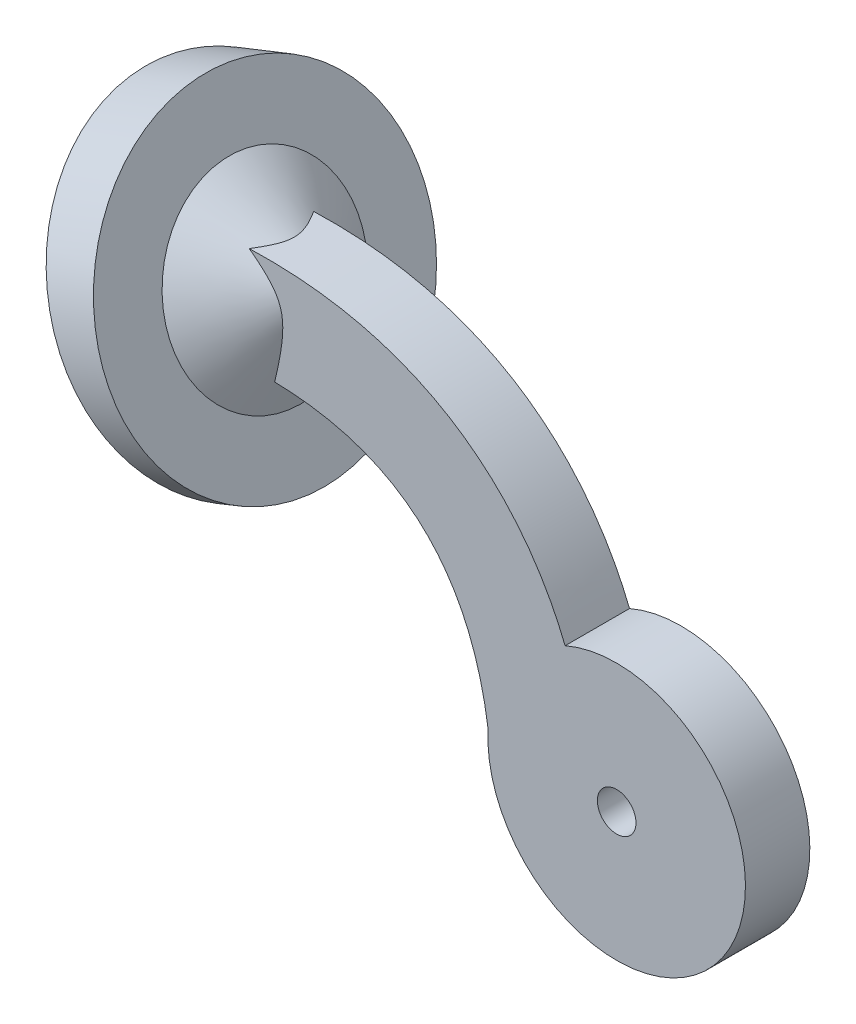
ISO-10303-21;
HEADER;
FILE_DESCRIPTION(('STEP AP214'),'2;1');
FILE_NAME('part.step','',(''),(''),'','','');
FILE_SCHEMA(('AUTOMOTIVE_DESIGN { 1 0 10303 214 1 1 1 1 }'));
ENDSEC;
DATA;
#1=APPLICATION_CONTEXT('core data for automotive mechanical design processes');
#2=APPLICATION_PROTOCOL_DEFINITION('international standard','automotive_design',2000,#1);
#3=PRODUCT_CONTEXT('',#1,'mechanical');
#4=PRODUCT('Part','Part','',(#3));
#5=PRODUCT_RELATED_PRODUCT_CATEGORY('part','',(#4));
#6=PRODUCT_DEFINITION_FORMATION('','',#4);
#7=PRODUCT_DEFINITION_CONTEXT('part definition',#1,'design');
#8=PRODUCT_DEFINITION('design','',#6,#7);
#9=PRODUCT_DEFINITION_SHAPE('','',#8);
#10=(LENGTH_UNIT() NAMED_UNIT(*) SI_UNIT(.MILLI.,.METRE.));
#11=(NAMED_UNIT(*) PLANE_ANGLE_UNIT() SI_UNIT($,.RADIAN.));
#12=(NAMED_UNIT(*) SI_UNIT($,.STERADIAN.) SOLID_ANGLE_UNIT());
#13=UNCERTAINTY_MEASURE_WITH_UNIT(LENGTH_MEASURE(1.E-05),#10,'distance_accuracy_value','');
#14=(GEOMETRIC_REPRESENTATION_CONTEXT(3) GLOBAL_UNCERTAINTY_ASSIGNED_CONTEXT((#13)) GLOBAL_UNIT_ASSIGNED_CONTEXT((#10,
#11,#12)) REPRESENTATION_CONTEXT('',''));
#15=CARTESIAN_POINT('',(0.,0.,0.));
#16=DIRECTION('',(0.,0.,1.));
#17=DIRECTION('',(1.,0.,0.));
#18=AXIS2_PLACEMENT_3D('',#15,#16,#17);
#19=CARTESIAN_POINT('',(-34.4570565539985,17.7708304764784,2.5));
#20=DIRECTION('',(0.92995625515955,0.367670183030424,0.));
#21=DIRECTION('',(-0.367670183030424,0.92995625515955,0.));
#22=AXIS2_PLACEMENT_3D('',#19,#20,#21);
#23=CYLINDRICAL_SURFACE('',#22,12.5);
#24=CARTESIAN_POINT('',(-32.8407138616819,18.409872377887,2.5));
#25=DIRECTION('',(0.870458463077709,0.492241875561591,0.));
#26=DIRECTION('',(0.492241875561591,-0.870458463077709,0.));
#27=AXIS2_PLACEMENT_3D('',#24,#25,#26);
#28=ELLIPSE('',#27,12.620259040557,12.5);
#29=CARTESIAN_POINT('',(-26.628493881485,7.42446108980115,2.5));
#30=VERTEX_POINT('',#29);
#31=EDGE_CURVE('E95',#30,#30,#28,.T.);
#32=ORIENTED_EDGE('',*,*,#31,.T.);
#33=EDGE_LOOP('',(#32));
#34=FACE_BOUND('',#33,.T.);
#35=CARTESIAN_POINT('',(-29.8072752782007,19.6091813916305,2.5));
#36=DIRECTION('',(-0.92995625515955,-0.367670183030424,0.));
#37=DIRECTION('',(0.367670183030424,-0.92995625515955,0.));
#38=AXIS2_PLACEMENT_3D('',#35,#36,#37);
#39=CIRCLE('',#38,12.5);
#40=CARTESIAN_POINT('',(-25.2113979903204,7.98472820213617,2.5));
#41=VERTEX_POINT('',#40);
#42=EDGE_CURVE('E138',#41,#41,#39,.T.);
#43=ORIENTED_EDGE('',*,*,#42,.T.);
#44=EDGE_LOOP('',(#43));
#45=FACE_BOUND('',#44,.T.);
#46=ADVANCED_FACE('F36',(#34,#45),#23,.T.);
#47=CARTESIAN_POINT('',(-29.8072752782007,19.6091813916305,2.5));
#48=DIRECTION('',(-0.92995625515955,-0.367670183030424,0.));
#49=DIRECTION('',(0.367670183030424,-0.92995625515955,0.));
#50=AXIS2_PLACEMENT_3D('',#47,#48,#49);
#51=PLANE('',#50);
#52=CARTESIAN_POINT('',(-29.8072752782007,19.6091813916306,2.5));
#53=DIRECTION('',(-0.92995625515955,-0.367670183030424,0.));
#54=DIRECTION('',(0.367670183030424,-0.92995625515955,0.));
#55=AXIS2_PLACEMENT_3D('',#52,#53,#54);
#56=CIRCLE('',#55,7.50000000000001);
#57=CARTESIAN_POINT('',(-27.0497489054726,12.6345094779339,2.5));
#58=VERTEX_POINT('',#57);
#59=EDGE_CURVE('E11',#58,#58,#56,.F.);
#60=ORIENTED_EDGE('',*,*,#59,.F.);
#61=EDGE_LOOP('',(#60));
#62=FACE_BOUND('',#61,.T.);
#63=ORIENTED_EDGE('',*,*,#42,.F.);
#64=EDGE_LOOP('',(#63));
#65=FACE_BOUND('',#64,.T.);
#66=ADVANCED_FACE('F182',(#62,#65),#51,.F.);
#67=CARTESIAN_POINT('',(-29.8072752782007,19.6091813916306,2.5));
#68=DIRECTION('',(-0.92995625515955,-0.367670183030424,0.));
#69=DIRECTION('',(-0.367670183030424,0.92995625515955,0.));
#70=AXIS2_PLACEMENT_3D('',#67,#68,#69);
#71=CONICAL_SURFACE('',#70,7.5,0.907571211037052);
#72=ORIENTED_EDGE('',*,*,#59,.T.);
#73=EDGE_LOOP('',(#72));
#74=FACE_BOUND('',#73,.T.);
#75=CARTESIAN_POINT('',(-31.1205374343894,23.6069702838381,-3.32523190287827));
#76=CARTESIAN_POINT('',(-31.0051639936193,23.6069702838381,-3.18649705970843));
#77=CARTESIAN_POINT('',(-30.8900523835198,23.6069702838381,-3.04754312371583));
#78=CARTESIAN_POINT('',(-30.6605097439369,23.6069702838381,-2.76906339166854));
#79=CARTESIAN_POINT('',(-30.5460787470098,23.6069702838381,-2.62953756878902));
#80=CARTESIAN_POINT('',(-30.3178228603325,23.6069702838381,-2.34949616964888));
#81=CARTESIAN_POINT('',(-30.2039997763352,23.6069702838381,-2.20897911982826));
#82=CARTESIAN_POINT('',(-29.9774469717052,23.6069702838381,-1.92707123248217));
#83=CARTESIAN_POINT('',(-29.8647172230717,23.6069702838381,-1.78568041748689));
#84=CARTESIAN_POINT('',(-29.6354836421515,23.6069702838381,-1.49519554390859));
#85=CARTESIAN_POINT('',(-29.5190471355668,23.6069702838381,-1.34604825346297));
#86=CARTESIAN_POINT('',(-29.288280191936,23.6069702838381,-1.04613432369152));
#87=CARTESIAN_POINT('',(-29.173949697126,23.6069702838381,-0.895367728960329));
#88=CARTESIAN_POINT('',(-28.9483389987224,23.6069702838381,-0.591778833231446));
#89=CARTESIAN_POINT('',(-28.8370560641258,23.6069702838381,-0.438958568773274));
#90=CARTESIAN_POINT('',(-28.618765934393,23.6069702838381,-0.130306331065555));
#91=CARTESIAN_POINT('',(-28.5117579599499,23.6069702838381,0.0255250855081514));
#92=CARTESIAN_POINT('',(-28.3336454107236,23.6069702838381,0.296777324323483));
#93=CARTESIAN_POINT('',(-28.2609526771352,23.6069702838381,0.41114942549434));
#94=CARTESIAN_POINT('',(-28.1202446670072,23.6069702838381,0.642839890528727));
#95=CARTESIAN_POINT('',(-28.0522317499643,23.6069702838381,0.760159700477639));
#96=CARTESIAN_POINT('',(-27.9233519520669,23.6069702838381,0.997842444176017));
#97=CARTESIAN_POINT('',(-27.8624457434877,23.6069702838381,1.11818366420332));
#98=CARTESIAN_POINT('',(-27.7504745698976,23.6069702838381,1.36327759556224));
#99=CARTESIAN_POINT('',(-27.6993995695899,23.6069702838381,1.48802565292288));
#100=CARTESIAN_POINT('',(-27.6061381373363,23.6069702838381,1.75843201354046));
#101=CARTESIAN_POINT('',(-27.5658115214314,23.6069702838381,1.90477777717941));
#102=CARTESIAN_POINT('',(-27.5245946546406,23.6069702838381,2.12740718603607));
#103=CARTESIAN_POINT('',(-27.5140705985687,23.6069702838381,2.20192663135317));
#104=CARTESIAN_POINT('',(-27.4999938967879,23.6069702838381,2.35163564738552));
#105=CARTESIAN_POINT('',(-27.4964405825722,23.6069702838381,2.42682515314595));
#106=CARTESIAN_POINT('',(-27.4965678246843,23.6069702838381,2.57749245069094));
#107=CARTESIAN_POINT('',(-27.5002769309905,23.6069702838381,2.65297021138838));
#108=CARTESIAN_POINT('',(-27.5147173319459,23.6069702838381,2.80324546374975));
#109=CARTESIAN_POINT('',(-27.5254493979574,23.6069702838381,2.87804287977336));
#110=CARTESIAN_POINT('',(-27.5533294339199,23.6069702838381,3.0268979485597));
#111=CARTESIAN_POINT('',(-27.5705173297153,23.6069702838381,3.10094799041398));
#112=CARTESIAN_POINT('',(-27.610372086373,23.6069702838381,3.24753734435399));
#113=CARTESIAN_POINT('',(-27.6330391932752,23.6069702838381,3.3200765884396));
#114=CARTESIAN_POINT('',(-27.6888500574699,23.6069702838381,3.48068765369976));
#115=CARTESIAN_POINT('',(-27.7232031029773,23.6069702838381,3.56833571883545));
#116=CARTESIAN_POINT('',(-27.7972756176536,23.6069702838381,3.74135509108605));
#117=CARTESIAN_POINT('',(-27.8369981634198,23.6069702838381,3.826725059077));
#118=CARTESIAN_POINT('',(-27.9206195615101,23.6069702838381,3.99557779536554));
#119=CARTESIAN_POINT('',(-27.9645261889795,23.6069702838381,4.07905667882809));
#120=CARTESIAN_POINT('',(-28.055506644688,23.6069702838381,4.24427365369316));
#121=CARTESIAN_POINT('',(-28.1025809523164,23.6069702838381,4.32601147913265));
#122=CARTESIAN_POINT('',(-28.1998555449538,23.6069702838381,4.48914055628722));
#123=CARTESIAN_POINT('',(-28.2500901621558,23.6069702838381,4.57051123214097));
#124=CARTESIAN_POINT('',(-28.3525402222912,23.6069702838381,4.7319946413547));
#125=CARTESIAN_POINT('',(-28.4047557336011,23.6069702838381,4.81210733115624));
#126=CARTESIAN_POINT('',(-28.5106889616268,23.6069702838381,4.97117695478836));
#127=CARTESIAN_POINT('',(-28.5644045943217,23.6069702838381,5.05013528045633));
#128=CARTESIAN_POINT('',(-28.6731020634842,23.6069702838381,5.2071689418581));
#129=CARTESIAN_POINT('',(-28.7280838533824,23.6069702838381,5.28524430991017));
#130=CARTESIAN_POINT('',(-28.9300254318794,23.6069702838381,5.56804773187805));
#131=CARTESIAN_POINT('',(-29.0800246440807,23.6069702838381,5.77060385207274));
#132=CARTESIAN_POINT('',(-29.3843688496473,23.6069702838381,6.17243284649893));
#133=CARTESIAN_POINT('',(-29.5387144522953,23.6069702838381,6.37170525414627));
#134=CARTESIAN_POINT('',(-29.8503406587801,23.6069702838381,6.7680563102495));
#135=CARTESIAN_POINT('',(-30.0076223202869,23.6069702838381,6.96513412566687));
#136=CARTESIAN_POINT('',(-30.3241779929453,23.6069702838381,7.35768399407499));
#137=CARTESIAN_POINT('',(-30.4834520398182,23.6069702838381,7.55315601817129));
#138=CARTESIAN_POINT('',(-30.8037188119825,23.6069702838381,7.94326721630479));
#139=CARTESIAN_POINT('',(-30.9647140878283,23.6069702838381,8.13790429390539));
#140=CARTESIAN_POINT('',(-31.2877794307574,23.6069702838381,8.52628787659347));
#141=CARTESIAN_POINT('',(-31.4498495126371,23.6069702838381,8.7200343693582));
#142=CARTESIAN_POINT('',(-31.9371951925877,23.6069702838381,9.30016444051819));
#143=CARTESIAN_POINT('',(-32.2636818557847,23.6069702838381,9.68553018434634));
#144=CARTESIAN_POINT('',(-32.878818339227,23.6069702838381,10.4078054432851));
#145=CARTESIAN_POINT('',(-33.1672412490756,23.6069702838381,10.7449087234719));
#146=CARTESIAN_POINT('',(-33.7451879924232,23.6069702838381,11.4182114746225));
#147=CARTESIAN_POINT('',(-34.0347119022587,23.6069702838381,11.7544108800532));
#148=CARTESIAN_POINT('',(-34.6137270727659,23.6069702838381,12.4252040200239));
#149=CARTESIAN_POINT('',(-34.9032161760065,23.6069702838381,12.7597996182542));
#150=CARTESIAN_POINT('',(-35.4827611025959,23.6069702838381,13.4284550628686));
#151=CARTESIAN_POINT('',(-35.7728168810431,23.6069702838381,13.7625149481631));
#152=CARTESIAN_POINT('',(-36.0630759827099,23.6069702838381,14.0963975880467));
#153=B_SPLINE_CURVE_WITH_KNOTS('',3,(#75,#76,#77,#78,#79,#80,#81,#82,#83,#84,#85,#86,#87,#88,
#89,#90,#91,#92,#93,#94,#95,#96,#97,#98,#99,#100,#101,#102,#103,#104,#105,#106,#107,#108,#109,
#110,#111,#112,#113,#114,#115,#116,#117,#118,#119,#120,#121,#122,#123,#124,#125,#126,#127,#128,
#129,#130,#131,#132,#133,#134,#135,#136,#137,#138,#139,#140,#141,#142,#143,#144,#145,#146,#147,
#148,#149,#150,#151,#152),.UNSPECIFIED.,.F.,.F.,(4,2,2,2,2,2,2,2,2,2,2,2,2,2,2,2,2,2,2,2,2,2,2,
2,2,2,2,2,2,2,2,2,2,2,2,2,2,2,4),(0.,0.541319518792293,1.0826647260282,1.6251608109496,
2.16764296539269,2.73527523040452,3.30289190305323,3.86998206893478,4.43696838053689,
4.84344375573494,5.25012259068257,5.65443189512884,6.05832628270889,6.51178303195432,
6.73727656901034,6.96274847976637,7.18910854394296,7.41549347441308,7.64330216473084,
7.87112108652492,8.15329966433827,8.43564061463926,8.71851685976914,9.00143601142438,
9.28828405625616,9.57514201155001,9.86161954295513,10.1480865544653,10.9041177215771,
11.6602554029577,12.4166709387781,13.1731000557892,13.9308729582787,14.6886563144553,
16.2038667398147,17.5348182505341,18.8658637878779,20.1932000505747,21.5204350907405),.UNSPECIFIED.);
#154=CARTESIAN_POINT('',(-28.5305711808186,23.6069702838381,0.));
#155=VERTEX_POINT('',#154);
#156=CARTESIAN_POINT('',(-28.4926601522574,23.6069702838381,0.0561379007340008));
#157=VERTEX_POINT('',#156);
#158=EDGE_CURVE('E97',#155,#157,#153,.T.);
#159=ORIENTED_EDGE('',*,*,#158,.F.);
#160=CARTESIAN_POINT('',(-29.2800834948723,5.57941477040267,0.));
#161=CARTESIAN_POINT('',(-29.1869362196633,5.9055074622979,0.));
#162=CARTESIAN_POINT('',(-29.093949304872,6.23164602567897,0.));
#163=CARTESIAN_POINT('',(-28.9083743878704,6.88403727023297,0.));
#164=CARTESIAN_POINT('',(-28.8157863864106,7.21028995161933,0.));
#165=CARTESIAN_POINT('',(-28.5387180643976,8.18932333472033,0.));
#166=CARTESIAN_POINT('',(-28.3549541386555,8.8423069961599,0.));
#167=CARTESIAN_POINT('',(-27.992544960449,10.1411668147796,0.));
#168=CARTESIAN_POINT('',(-27.8138646601903,10.7870331509975,0.));
#169=CARTESIAN_POINT('',(-27.5494038589756,11.7567797927855,0.));
#170=CARTESIAN_POINT('',(-27.4618465611984,12.0801750977669,0.));
#171=CARTESIAN_POINT('',(-27.2883279661573,12.7273931241951,0.));
#172=CARTESIAN_POINT('',(-27.2023666617791,13.0512158437297,0.));
#173=CARTESIAN_POINT('',(-27.0468647267721,13.6450623314767,0.));
#174=CARTESIAN_POINT('',(-26.9769885702604,13.9149981039332,0.));
#175=CARTESIAN_POINT('',(-26.8392486777998,14.4554193288412,0.));
#176=CARTESIAN_POINT('',(-26.7713851863357,14.725904843842,0.));
#177=CARTESIAN_POINT('',(-26.6379738010209,15.2694390038592,0.));
#178=CARTESIAN_POINT('',(-26.5724452449148,15.5424924098266,0.));
#179=CARTESIAN_POINT('',(-26.4454087640843,16.0894363077118,0.));
#180=CARTESIAN_POINT('',(-26.3838993309241,16.3633264447217,0.));
#181=CARTESIAN_POINT('',(-26.2959151033157,16.7761376086191,0.));
#182=CARTESIAN_POINT('',(-26.2672032185622,16.9145809911834,0.));
#183=CARTESIAN_POINT('',(-26.2116938137583,17.1918497096161,0.));
#184=CARTESIAN_POINT('',(-26.184896246354,17.330675035948,0.));
#185=CARTESIAN_POINT('',(-26.1336741213904,17.609004929105,0.));
#186=CARTESIAN_POINT('',(-26.1092535861228,17.7485102417407,0.));
#187=CARTESIAN_POINT('',(-26.0635295413135,18.028029379687,0.));
#188=CARTESIAN_POINT('',(-26.0422258671515,18.1680431777409,0.));
#189=CARTESIAN_POINT('',(-26.0038264738955,18.447623886291,0.));
#190=CARTESIAN_POINT('',(-25.986701403564,18.5871866921213,0.));
#191=CARTESIAN_POINT('',(-25.9577531610034,18.8669222988036,0.));
#192=CARTESIAN_POINT('',(-25.9459315237782,19.0070952644199,0.));
#193=CARTESIAN_POINT('',(-25.9294174185569,19.2874885539533,0.));
#194=CARTESIAN_POINT('',(-25.9247046944716,19.427707600269,0.));
#195=CARTESIAN_POINT('',(-25.9247538157918,19.708108750193,0.));
#196=CARTESIAN_POINT('',(-25.9295079033451,19.8482907899767,0.));
#197=CARTESIAN_POINT('',(-25.9483056098937,20.0875470174699,0.));
#198=CARTESIAN_POINT('',(-25.9592862156762,20.1868550313554,0.));
#199=CARTESIAN_POINT('',(-25.9886977407466,20.3843951689487,0.));
#200=CARTESIAN_POINT('',(-26.0071287013221,20.4826272866911,0.));
#201=CARTESIAN_POINT('',(-26.0522113882823,20.6765028103061,0.));
#202=CARTESIAN_POINT('',(-26.0788059141249,20.7721593430004,0.));
#203=CARTESIAN_POINT('',(-26.140691971557,20.960623711088,0.));
#204=CARTESIAN_POINT('',(-26.1759829825355,21.0534317166331,0.));
#205=CARTESIAN_POINT('',(-26.2550667289289,21.2354260658087,0.));
#206=CARTESIAN_POINT('',(-26.2988657370792,21.3246096782387,0.));
#207=CARTESIAN_POINT('',(-26.3941207239742,21.4987939478743,0.));
#208=CARTESIAN_POINT('',(-26.4455789329476,21.583793377092,0.));
#209=CARTESIAN_POINT('',(-26.5553838184296,21.7501435531691,0.));
#210=CARTESIAN_POINT('',(-26.6137809021972,21.8314608258191,0.));
#211=CARTESIAN_POINT('',(-26.7053317594127,21.9503362675322,0.));
#212=CARTESIAN_POINT('',(-26.7365067063622,21.9894432986491,0.));
#213=CARTESIAN_POINT('',(-26.8000386655689,22.0666893680294,0.));
#214=CARTESIAN_POINT('',(-26.8323957379019,22.1048283569292,0.));
#215=CARTESIAN_POINT('',(-26.9321197765667,22.219123155537,0.));
#216=CARTESIAN_POINT('',(-27.0011244469455,22.2938531060443,0.));
#217=CARTESIAN_POINT('',(-27.142491234539,22.4400817253065,0.));
#218=CARTESIAN_POINT('',(-27.2148544290605,22.5115793425111,0.));
#219=CARTESIAN_POINT('',(-27.3622579663912,22.6519111308992,0.));
#220=CARTESIAN_POINT('',(-27.4373011210452,22.7207423366559,0.));
#221=CARTESIAN_POINT('',(-27.5894339617086,22.8561110072996,0.));
#222=CARTESIAN_POINT('',(-27.6665238841224,22.9226482051677,0.));
#223=CARTESIAN_POINT('',(-27.9008554754016,23.1199631043415,0.));
#224=CARTESIAN_POINT('',(-28.0605244376195,23.2478544738959,0.));
#225=CARTESIAN_POINT('',(-28.3838723133582,23.4981885533761,0.));
#226=CARTESIAN_POINT('',(-28.5475487921838,23.6206344501999,0.));
#227=CARTESIAN_POINT('',(-28.8804900124381,23.863723651399,0.));
#228=CARTESIAN_POINT('',(-29.0498024488718,23.9843014070908,0.));
#229=CARTESIAN_POINT('',(-29.3904679465552,24.2225733494064,0.));
#230=CARTESIAN_POINT('',(-29.561821270884,24.3402671581657,0.));
#231=CARTESIAN_POINT('',(-29.9054998223318,24.5731529790978,0.));
#232=CARTESIAN_POINT('',(-30.0778208530663,24.6883511978872,0.));
#233=CARTESIAN_POINT('',(-30.4235457183062,24.9170888883564,0.));
#234=CARTESIAN_POINT('',(-30.5969494982178,25.0306284427198,0.));
#235=CARTESIAN_POINT('',(-31.1245033547959,25.3733024444297,0.));
#236=CARTESIAN_POINT('',(-31.4799510042518,25.6004375378003,0.));
#237=CARTESIAN_POINT('',(-32.1929476981522,26.0513895997112,0.));
#238=CARTESIAN_POINT('',(-32.5504967965717,26.2752064824995,0.));
#239=CARTESIAN_POINT('',(-33.2670226394113,26.7206064787527,0.));
#240=CARTESIAN_POINT('',(-33.6259994975215,26.9421894091565,0.));
#241=CARTESIAN_POINT('',(-34.3449258502051,27.3837728033943,0.));
#242=CARTESIAN_POINT('',(-34.7048753487251,27.6037732607939,0.));
#243=CARTESIAN_POINT('',(-35.4260019673524,28.0429379298366,0.));
#244=CARTESIAN_POINT('',(-35.7871801116619,28.2621004587083,0.));
#245=CARTESIAN_POINT('',(-36.5100643740057,28.6995533093725,0.));
#246=CARTESIAN_POINT('',(-36.8717704925306,28.9178436303533,0.));
#247=CARTESIAN_POINT('',(-37.9574533744452,29.5717004395948,0.));
#248=CARTESIAN_POINT('',(-38.6820284333472,30.0062732806126,0.));
#249=CARTESIAN_POINT('',(-40.0652117342373,30.8337143696964,0.));
#250=CARTESIAN_POINT('',(-40.7237330512579,31.2267281102973,0.));
#251=CARTESIAN_POINT('',(-42.0413534100328,32.0118077746178,0.));
#252=CARTESIAN_POINT('',(-42.7004524600863,32.4038736844074,0.));
#253=CARTESIAN_POINT('',(-44.0179981430194,33.1866944034327,0.));
#254=CARTESIAN_POINT('',(-44.6764441259601,33.5774503069848,0.));
#255=CARTESIAN_POINT('',(-45.9936329732718,34.3584377558714,0.));
#256=CARTESIAN_POINT('',(-46.6523758327929,34.7486693093851,0.));
#257=CARTESIAN_POINT('',(-47.3112239126866,35.13872287492,0.));
#258=B_SPLINE_CURVE_WITH_KNOTS('',3,(#160,#161,#162,#163,#164,#165,#166,#167,#168,#169,#170,
#171,#172,#173,#174,#175,#176,#177,#178,#179,#180,#181,#182,#183,#184,#185,#186,#187,#188,#189,
#190,#191,#192,#193,#194,#195,#196,#197,#198,#199,#200,#201,#202,#203,#204,#205,#206,#207,#208,
#209,#210,#211,#212,#213,#214,#215,#216,#217,#218,#219,#220,#221,#222,#223,#224,#225,#226,#227,
#228,#229,#230,#231,#232,#233,#234,#235,#236,#237,#238,#239,#240,#241,#242,#243,#244,#245,#246,
#247,#248,#249,#250,#251,#252,#253,#254,#255,#256,#257),.UNSPECIFIED.,.F.,.F.,(4,2,2,2,2,2,2,2,
2,2,2,2,2,2,2,2,2,2,2,2,2,2,2,2,2,2,2,2,2,2,2,2,2,2,2,2,2,2,2,2,2,2,2,2,2,2,2,2,4),(0.,
1.01740640450644,2.03481472208461,4.06985720993256,6.0802246559577,7.08533742492444,
8.09044571234148,8.92694015227436,9.76353579108573,10.6059371332561,11.4480204719758,
11.8721783210336,12.2963256741403,12.7211787057049,13.1460092901254,13.5677638472383,
13.9896403966153,14.4103125679285,14.8306401491453,15.1301473983627,15.4296563073846,
15.7271127507971,16.0245513914501,16.3222101643203,16.6199557805231,16.9200144179472,
17.0700327797614,17.2200587761794,17.5250599329267,17.830159609696,18.1355893907005,
18.4410546040424,19.054580358282,19.6677421972677,20.2912781389578,20.9148953462429,
21.5367241745119,22.1585218983978,23.4239513719802,24.6894134910103,25.954978478926,
27.2205486098407,28.4879603915735,29.7553733523326,32.2900807510966,34.5907301168848,
36.8914130917959,39.1884047083112,41.4853600693166),.UNSPECIFIED.);
#259=CARTESIAN_POINT('',(-26.5542080855162,15.6224921952079,0.));
#260=VERTEX_POINT('',#259);
#261=EDGE_CURVE('E197',#155,#260,#258,.F.);
#262=ORIENTED_EDGE('',*,*,#261,.T.);
#263=CARTESIAN_POINT('',(-26.5542080855162,15.6224921952079,5.));
#264=CARTESIAN_POINT('',(-26.5164500016536,15.6216886086622,4.87321119150024));
#265=CARTESIAN_POINT('',(-26.4810613583395,15.620861041919,4.7456994341431));
#266=CARTESIAN_POINT('',(-26.4154366055507,15.6192204872499,4.48931583874866));
#267=CARTESIAN_POINT('',(-26.3852021503932,15.6184075040795,4.36044357807769));
#268=CARTESIAN_POINT('',(-26.3302868348039,15.6168581980058,4.10133006015185));
#269=CARTESIAN_POINT('',(-26.3056135855806,15.6161219808976,3.97108717899045));
#270=CARTESIAN_POINT('',(-26.2622547658564,15.6147843432878,3.70961821836881));
#271=CARTESIAN_POINT('',(-26.2435685302818,15.614182907816,3.57839224977443));
#272=CARTESIAN_POINT('',(-26.2129168306884,15.6131756619432,3.31879014124457));
#273=CARTESIAN_POINT('',(-26.2007816436951,15.6127649542936,3.19043413315659));
#274=CARTESIAN_POINT('',(-26.1826707973134,15.612146086313,2.93328854059001));
#275=CARTESIAN_POINT('',(-26.176694996309,15.6119379213251,2.80449896614824));
#276=CARTESIAN_POINT('',(-26.1710090307555,15.6117399571368,2.54689364304683));
#277=CARTESIAN_POINT('',(-26.1712933525161,15.6117499657767,2.41807801733945));
#278=CARTESIAN_POINT('',(-26.1781075658188,15.611986970892,2.16062650982389));
#279=CARTESIAN_POINT('',(-26.1846369257502,15.6122139488979,2.0319906136496));
#280=CARTESIAN_POINT('',(-26.2061859058179,15.6129485307026,1.74368026225394));
#281=CARTESIAN_POINT('',(-26.2228949631283,15.6135113034323,1.58413028707884));
#282=CARTESIAN_POINT('',(-26.2654050051721,15.6148833809038,1.26623490283954));
#283=CARTESIAN_POINT('',(-26.2912073695437,15.6156927230528,1.10788968028692));
#284=CARTESIAN_POINT('',(-26.3518248778889,15.6174819313997,0.790051968952749));
#285=CARTESIAN_POINT('',(-26.3867910397991,15.6184645548754,0.630588548272705));
#286=CARTESIAN_POINT('',(-26.4647073103595,15.6204739926885,0.31371213425494));
#287=CARTESIAN_POINT('',(-26.5076529923622,15.6215007822832,0.156298055601925));
#288=CARTESIAN_POINT('',(-26.5542080855162,15.6224921952079,0.));
#289=B_SPLINE_CURVE_WITH_KNOTS('',3,(#263,#264,#265,#266,#267,#268,#269,#270,#271,#272,#273,
#274,#275,#276,#277,#278,#279,#280,#281,#282,#283,#284,#285,#286,#287,#288),.UNSPECIFIED.,.F.,
.F.,(4,2,2,2,2,2,2,2,2,2,2,2,4),(0.,0.396884025615011,0.793895198487433,1.19144647547701,
1.58895357473542,1.97559669496414,2.36223092534203,2.74852463588441,3.1347854659951,
3.61577135493415,4.09683025057283,4.58637867159276,5.07565632157385),.UNSPECIFIED.);
#290=CARTESIAN_POINT('',(-26.5542080855162,15.6224921952079,5.));
#291=VERTEX_POINT('',#290);
#292=EDGE_CURVE('E191',#291,#260,#289,.T.);
#293=ORIENTED_EDGE('',*,*,#292,.F.);
#294=CARTESIAN_POINT('',(-29.2800834948723,5.57941477040267,5.));
#295=CARTESIAN_POINT('',(-29.1869362196633,5.9055074622979,5.));
#296=CARTESIAN_POINT('',(-29.093949304872,6.23164602567897,5.));
#297=CARTESIAN_POINT('',(-28.9083743878704,6.88403727023297,5.));
#298=CARTESIAN_POINT('',(-28.8157863864106,7.21028995161933,5.));
#299=CARTESIAN_POINT('',(-28.5387180643976,8.18932333472033,5.));
#300=CARTESIAN_POINT('',(-28.3549541386555,8.8423069961599,5.));
#301=CARTESIAN_POINT('',(-27.992544960449,10.1411668147796,5.));
#302=CARTESIAN_POINT('',(-27.8138646601903,10.7870331509975,5.));
#303=CARTESIAN_POINT('',(-27.5494038589756,11.7567797927855,5.));
#304=CARTESIAN_POINT('',(-27.4618465611984,12.0801750977669,5.));
#305=CARTESIAN_POINT('',(-27.2883279661573,12.7273931241951,5.));
#306=CARTESIAN_POINT('',(-27.2023666617791,13.0512158437297,5.));
#307=CARTESIAN_POINT('',(-27.0468647267721,13.6450623314767,5.));
#308=CARTESIAN_POINT('',(-26.9769885702604,13.9149981039332,5.));
#309=CARTESIAN_POINT('',(-26.8392486777998,14.4554193288412,5.));
#310=CARTESIAN_POINT('',(-26.7713851863357,14.725904843842,5.));
#311=CARTESIAN_POINT('',(-26.6379738010209,15.2694390038592,5.));
#312=CARTESIAN_POINT('',(-26.5724452449148,15.5424924098266,5.));
#313=CARTESIAN_POINT('',(-26.4454087640843,16.0894363077118,5.));
#314=CARTESIAN_POINT('',(-26.3838993309241,16.3633264447217,5.));
#315=CARTESIAN_POINT('',(-26.2959151033157,16.7761376086191,5.));
#316=CARTESIAN_POINT('',(-26.2672032185622,16.9145809911834,5.));
#317=CARTESIAN_POINT('',(-26.2116938137583,17.1918497096161,5.));
#318=CARTESIAN_POINT('',(-26.184896246354,17.330675035948,5.));
#319=CARTESIAN_POINT('',(-26.1336741213904,17.609004929105,5.));
#320=CARTESIAN_POINT('',(-26.1092535861228,17.7485102417407,5.));
#321=CARTESIAN_POINT('',(-26.0635295413135,18.028029379687,5.));
#322=CARTESIAN_POINT('',(-26.0422258671515,18.1680431777409,5.));
#323=CARTESIAN_POINT('',(-26.0038264738955,18.447623886291,5.));
#324=CARTESIAN_POINT('',(-25.986701403564,18.5871866921213,5.));
#325=CARTESIAN_POINT('',(-25.9577531610034,18.8669222988036,5.));
#326=CARTESIAN_POINT('',(-25.9459315237782,19.0070952644199,5.));
#327=CARTESIAN_POINT('',(-25.9294174185569,19.2874885539533,5.));
#328=CARTESIAN_POINT('',(-25.9247046944716,19.427707600269,5.));
#329=CARTESIAN_POINT('',(-25.9247538157918,19.708108750193,5.));
#330=CARTESIAN_POINT('',(-25.9295079033451,19.8482907899767,5.));
#331=CARTESIAN_POINT('',(-25.9483056098937,20.0875470174699,5.));
#332=CARTESIAN_POINT('',(-25.9592862156762,20.1868550313554,5.));
#333=CARTESIAN_POINT('',(-25.9886977407466,20.3843951689487,5.));
#334=CARTESIAN_POINT('',(-26.0071287013221,20.4826272866911,5.));
#335=CARTESIAN_POINT('',(-26.0522113882823,20.6765028103061,5.));
#336=CARTESIAN_POINT('',(-26.0788059141249,20.7721593430004,5.));
#337=CARTESIAN_POINT('',(-26.140691971557,20.960623711088,5.));
#338=CARTESIAN_POINT('',(-26.1759829825355,21.0534317166331,5.));
#339=CARTESIAN_POINT('',(-26.2550667289289,21.2354260658087,5.));
#340=CARTESIAN_POINT('',(-26.2988657370792,21.3246096782387,5.));
#341=CARTESIAN_POINT('',(-26.3941207239742,21.4987939478743,5.));
#342=CARTESIAN_POINT('',(-26.4455789329476,21.583793377092,5.));
#343=CARTESIAN_POINT('',(-26.5553838184296,21.7501435531691,5.));
#344=CARTESIAN_POINT('',(-26.6137809021972,21.8314608258191,5.));
#345=CARTESIAN_POINT('',(-26.7053317594127,21.9503362675322,5.));
#346=CARTESIAN_POINT('',(-26.7365067063622,21.9894432986491,5.));
#347=CARTESIAN_POINT('',(-26.8000386655689,22.0666893680294,5.));
#348=CARTESIAN_POINT('',(-26.8323957379019,22.1048283569292,5.));
#349=CARTESIAN_POINT('',(-26.9321197765667,22.219123155537,5.));
#350=CARTESIAN_POINT('',(-27.0011244469455,22.2938531060443,5.));
#351=CARTESIAN_POINT('',(-27.142491234539,22.4400817253065,5.));
#352=CARTESIAN_POINT('',(-27.2148544290605,22.5115793425111,5.));
#353=CARTESIAN_POINT('',(-27.3622579663912,22.6519111308992,5.));
#354=CARTESIAN_POINT('',(-27.4373011210452,22.7207423366559,5.));
#355=CARTESIAN_POINT('',(-27.5894339617086,22.8561110072996,5.));
#356=CARTESIAN_POINT('',(-27.6665238841224,22.9226482051677,5.));
#357=CARTESIAN_POINT('',(-27.9008554754016,23.1199631043415,5.));
#358=CARTESIAN_POINT('',(-28.0605244376195,23.2478544738959,5.));
#359=CARTESIAN_POINT('',(-28.3838723133582,23.4981885533761,5.));
#360=CARTESIAN_POINT('',(-28.5475487921838,23.6206344501999,5.));
#361=CARTESIAN_POINT('',(-28.8804900124381,23.863723651399,5.));
#362=CARTESIAN_POINT('',(-29.0498024488718,23.9843014070908,5.));
#363=CARTESIAN_POINT('',(-29.3904679465552,24.2225733494064,5.));
#364=CARTESIAN_POINT('',(-29.561821270884,24.3402671581657,5.));
#365=CARTESIAN_POINT('',(-29.9054998223318,24.5731529790978,5.));
#366=CARTESIAN_POINT('',(-30.0778208530663,24.6883511978872,5.));
#367=CARTESIAN_POINT('',(-30.4235457183062,24.9170888883564,5.));
#368=CARTESIAN_POINT('',(-30.5969494982178,25.0306284427198,5.));
#369=CARTESIAN_POINT('',(-31.1245033547959,25.3733024444297,5.));
#370=CARTESIAN_POINT('',(-31.4799510042518,25.6004375378003,5.));
#371=CARTESIAN_POINT('',(-32.1929476981522,26.0513895997112,5.));
#372=CARTESIAN_POINT('',(-32.5504967965717,26.2752064824995,5.));
#373=CARTESIAN_POINT('',(-33.2670226394113,26.7206064787527,5.));
#374=CARTESIAN_POINT('',(-33.6259994975215,26.9421894091565,5.));
#375=CARTESIAN_POINT('',(-34.3449258502051,27.3837728033943,5.));
#376=CARTESIAN_POINT('',(-34.7048753487251,27.6037732607939,5.));
#377=CARTESIAN_POINT('',(-35.4260019673524,28.0429379298366,5.));
#378=CARTESIAN_POINT('',(-35.787180111662,28.2621004587083,5.));
#379=CARTESIAN_POINT('',(-36.5100643740057,28.6995533093725,5.));
#380=CARTESIAN_POINT('',(-36.8717704925306,28.9178436303533,5.));
#381=CARTESIAN_POINT('',(-37.9574533744452,29.5717004395948,5.));
#382=CARTESIAN_POINT('',(-38.6820284333472,30.0062732806126,5.));
#383=CARTESIAN_POINT('',(-40.0652117342373,30.8337143696965,5.));
#384=CARTESIAN_POINT('',(-40.7237330512579,31.2267281102973,5.));
#385=CARTESIAN_POINT('',(-42.0413534100328,32.0118077746178,5.));
#386=CARTESIAN_POINT('',(-42.7004524600863,32.4038736844074,5.));
#387=CARTESIAN_POINT('',(-44.0179981430194,33.1866944034327,5.));
#388=CARTESIAN_POINT('',(-44.6764441259601,33.5774503069848,5.));
#389=CARTESIAN_POINT('',(-45.9936329732718,34.3584377558714,5.));
#390=CARTESIAN_POINT('',(-46.6523758327929,34.7486693093851,5.));
#391=CARTESIAN_POINT('',(-47.3112239126866,35.13872287492,5.));
#392=B_SPLINE_CURVE_WITH_KNOTS('',3,(#294,#295,#296,#297,#298,#299,#300,#301,#302,#303,#304,
#305,#306,#307,#308,#309,#310,#311,#312,#313,#314,#315,#316,#317,#318,#319,#320,#321,#322,#323,
#324,#325,#326,#327,#328,#329,#330,#331,#332,#333,#334,#335,#336,#337,#338,#339,#340,#341,#342,
#343,#344,#345,#346,#347,#348,#349,#350,#351,#352,#353,#354,#355,#356,#357,#358,#359,#360,#361,
#362,#363,#364,#365,#366,#367,#368,#369,#370,#371,#372,#373,#374,#375,#376,#377,#378,#379,#380,
#381,#382,#383,#384,#385,#386,#387,#388,#389,#390,#391),.UNSPECIFIED.,.F.,.F.,(4,2,2,2,2,2,2,2,
2,2,2,2,2,2,2,2,2,2,2,2,2,2,2,2,2,2,2,2,2,2,2,2,2,2,2,2,2,2,2,2,2,2,2,2,2,2,2,2,4),(0.,
1.01740640450644,2.03481472208461,4.06985720993256,6.0802246559577,7.08533742492444,
8.09044571234148,8.92694015227436,9.76353579108573,10.6059371332561,11.4480204719758,
11.8721783210336,12.2963256741403,12.7211787057049,13.1460092901254,13.5677638472383,
13.9896403966153,14.4103125679285,14.8306401491453,15.1301473983627,15.4296563073846,
15.7271127507971,16.0245513914501,16.3222101643203,16.6199557805231,16.9200144179472,
17.0700327797614,17.2200587761794,17.5250599329267,17.830159609696,18.1355893907005,
18.4410546040424,19.054580358282,19.6677421972677,20.2912781389578,20.9148953462429,
21.5367241745119,22.1585218983978,23.4239513719802,24.6894134910103,25.954978478926,
27.2205486098407,28.4879603915735,29.7553733523326,32.2900807510966,34.5907301168848,
36.8914130917959,39.1884047083112,41.4853600693166),.UNSPECIFIED.);
#393=CARTESIAN_POINT('',(-28.5305711808186,23.6069702838381,5.));
#394=VERTEX_POINT('',#393);
#395=EDGE_CURVE('E52',#394,#291,#392,.F.);
#396=ORIENTED_EDGE('',*,*,#395,.F.);
#397=CARTESIAN_POINT('',(-28.4926601522576,23.6069702838381,4.94386209926636));
#398=VERTEX_POINT('',#397);
#399=EDGE_CURVE('E87',#398,#394,#153,.T.);
#400=ORIENTED_EDGE('',*,*,#399,.F.);
#401=CARTESIAN_POINT('',(-28.4926601522574,23.6069702838381,0.0561379007340008));
#402=CARTESIAN_POINT('',(-28.4397104224036,23.6087328775119,0.138510360843843));
#403=CARTESIAN_POINT('',(-28.38745680026,23.6103646094345,0.221349824845743));
#404=CARTESIAN_POINT('',(-28.2845594300683,23.6133837300154,0.388721184691839));
#405=CARTESIAN_POINT('',(-28.2339274353876,23.6147695687826,0.473260318506959));
#406=CARTESIAN_POINT('',(-28.1350306454628,23.6172960250418,0.643996669546174));
#407=CARTESIAN_POINT('',(-28.0867718398766,23.6184360444053,0.730197387251298));
#408=CARTESIAN_POINT('',(-27.9914692615091,23.6205244092151,0.908248252859215));
#409=CARTESIAN_POINT('',(-27.9445748627386,23.6214619814546,1.00017919651158));
#410=CARTESIAN_POINT('',(-27.8556803019826,23.6230958771914,1.18618803564454));
#411=CARTESIAN_POINT('',(-27.8136709499596,23.6237926587149,1.28026148812141));
#412=CARTESIAN_POINT('',(-27.7361467173937,23.6249718602284,1.47095760732591));
#413=CARTESIAN_POINT('',(-27.7006232755756,23.6254545640182,1.56757671809628));
#414=CARTESIAN_POINT('',(-27.6448772380883,23.6261532058339,1.74238130518699));
#415=CARTESIAN_POINT('',(-27.6230070517159,23.6264042557541,1.82003596491314));
#416=CARTESIAN_POINT('',(-27.5856381915268,23.6268106403482,1.97689218994235));
#417=CARTESIAN_POINT('',(-27.5701393522345,23.626965977508,2.05609371501447));
#418=CARTESIAN_POINT('',(-27.5467179057699,23.6271932380228,2.21434723762957));
#419=CARTESIAN_POINT('',(-27.5386790301869,23.6272664453353,2.29338168171071));
#420=CARTESIAN_POINT('',(-27.5303624226082,23.6273420910376,2.45186004548678));
#421=CARTESIAN_POINT('',(-27.5300839216539,23.6273445364391,2.53130392383151));
#422=CARTESIAN_POINT('',(-27.537311279684,23.6272789493718,2.68988710830417));
#423=CARTESIAN_POINT('',(-27.5448228810988,23.6272108649124,2.76902614652889));
#424=CARTESIAN_POINT('',(-27.5670709036179,23.626996350766,2.92627460362121));
#425=CARTESIAN_POINT('',(-27.5818087048325,23.6268499061128,3.00438382287933));
#426=CARTESIAN_POINT('',(-27.6178345874675,23.6264623559289,3.16034217982215));
#427=CARTESIAN_POINT('',(-27.6392217849975,23.6262198016594,3.23816802142523));
#428=CARTESIAN_POINT('',(-27.687344135543,23.6256242978048,3.39211961453413));
#429=CARTESIAN_POINT('',(-27.7140793069257,23.6252713478404,3.4682453602001));
#430=CARTESIAN_POINT('',(-27.7914015513314,23.6241574500366,3.66984258614401));
#431=CARTESIAN_POINT('',(-27.8458787230895,23.6232820782659,3.79381250648989));
#432=CARTESIAN_POINT('',(-27.9630321416572,23.6211162037347,4.03789225273349));
#433=CARTESIAN_POINT('',(-28.0257188788524,23.6198251666951,4.15799689061471));
#434=CARTESIAN_POINT('',(-28.1540522426398,23.6168481296451,4.39038679966243));
#435=CARTESIAN_POINT('',(-28.2194820839809,23.6151798743861,4.50279310024885));
#436=CARTESIAN_POINT('',(-28.3202326405061,23.6123481019419,4.66956122561295));
#437=CARTESIAN_POINT('',(-28.3541943096982,23.6113511279341,4.72475726568422));
#438=CARTESIAN_POINT('',(-28.4228836746249,23.6092452047762,4.83465872132297));
#439=CARTESIAN_POINT('',(-28.4576112685191,23.6081362704435,4.88936420077286));
#440=CARTESIAN_POINT('',(-28.4926601522574,23.6069702838381,4.943862099266));
#441=B_SPLINE_CURVE_WITH_KNOTS('',3,(#401,#402,#403,#404,#405,#406,#407,#408,#409,#410,#411,
#412,#413,#414,#415,#416,#417,#418,#419,#420,#421,#422,#423,#424,#425,#426,#427,#428,#429,#430,
#431,#432,#433,#434,#435,#436,#437,#438,#439,#440),.UNSPECIFIED.,.F.,.F.,(4,2,2,2,2,2,2,2,2,2,2,
2,2,2,2,2,2,2,2,4),(0.,0.293834014977272,0.589458950068321,0.885795280554342,1.19530461859697,
1.50422193250884,1.81272848617553,2.05453651269135,2.29633825860381,2.53430475778697,
2.77224767730461,3.01036611987434,3.24853005769869,3.49042962611038,3.7323300253239,
4.13807793149279,4.54434946565404,4.93446758001171,5.12890828870035,5.32332329784123),.UNSPECIFIED.);
#442=EDGE_CURVE('E90',#157,#398,#441,.T.);
#443=ORIENTED_EDGE('',*,*,#442,.F.);
#444=EDGE_LOOP('',(#159,#262,#293,#396,#400,#443));
#445=FACE_BOUND('',#444,.T.);
#446=ADVANCED_FACE('F89',(#74,#445),#71,.T.);
#447=CARTESIAN_POINT('',(0.,0.,5.));
#448=DIRECTION('',(0.,0.,-1.));
#449=DIRECTION('',(-1.,0.,0.));
#450=AXIS2_PLACEMENT_3D('',#447,#448,#449);
#451=CYLINDRICAL_SURFACE('',#450,10.);
#452=DIRECTION('',(0.,0.,-1.));
#453=VECTOR('',#452,1.);
#454=CARTESIAN_POINT('',(-4.0020728236547,9.16424645642861,5.));
#455=LINE('',#454,#453);
#456=CARTESIAN_POINT('',(-4.0020728236547,9.16424645642862,0.));
#457=VERTEX_POINT('',#456);
#458=CARTESIAN_POINT('',(-4.0020728236547,9.16424645642862,5.));
#459=VERTEX_POINT('',#458);
#460=EDGE_CURVE('E110',#457,#459,#455,.F.);
#461=ORIENTED_EDGE('',*,*,#460,.T.);
#462=CARTESIAN_POINT('',(0.,0.,5.));
#463=DIRECTION('',(0.,0.,1.));
#464=DIRECTION('',(1.,0.,0.));
#465=AXIS2_PLACEMENT_3D('',#462,#463,#464);
#466=CIRCLE('',#465,10.);
#467=CARTESIAN_POINT('',(-9.98283011872585,0.585749793563791,5.));
#468=VERTEX_POINT('',#467);
#469=EDGE_CURVE('E45',#468,#459,#466,.T.);
#470=ORIENTED_EDGE('',*,*,#469,.F.);
#471=DIRECTION('',(0.,0.,-1.));
#472=VECTOR('',#471,1.);
#473=CARTESIAN_POINT('',(-9.98283011872585,0.585749793563785,5.));
#474=LINE('',#473,#472);
#475=CARTESIAN_POINT('',(-9.98283011872585,0.585749793563761,0.));
#476=VERTEX_POINT('',#475);
#477=EDGE_CURVE('E112',#468,#476,#474,.T.);
#478=ORIENTED_EDGE('',*,*,#477,.T.);
#479=CARTESIAN_POINT('',(0.,0.,0.));
#480=DIRECTION('',(0.,0.,1.));
#481=DIRECTION('',(1.,0.,0.));
#482=AXIS2_PLACEMENT_3D('',#479,#480,#481);
#483=CIRCLE('',#482,10.);
#484=EDGE_CURVE('E122',#476,#457,#483,.T.);
#485=ORIENTED_EDGE('',*,*,#484,.T.);
#486=EDGE_LOOP('',(#461,#470,#478,#485));
#487=FACE_BOUND('',#486,.T.);
#488=ADVANCED_FACE('F38',(#487),#451,.T.);
#489=CARTESIAN_POINT('',(-9.69085166382886,-2.46726448312001,5.));
#490=CARTESIAN_POINT('',(-10.6892087201044,16.1947536265854,5.));
#491=CARTESIAN_POINT('',(-28.2266979493642,15.611392499423,5.));
#492=B_SPLINE_CURVE_WITH_KNOTS('',2,(#489,#490,#491),.UNSPECIFIED.,.F.,.F.,(3,3),(0.,1.),.UNSPECIFIED.);
#493=DIRECTION('',(0.,0.,-1.));
#494=VECTOR('',#493,1.);
#495=SURFACE_OF_LINEAR_EXTRUSION('',#492,#494);
#496=EDGE_CURVE('E134',#468,#291,#492,.T.);
#497=ORIENTED_EDGE('',*,*,#496,.T.);
#498=ORIENTED_EDGE('',*,*,#292,.T.);
#499=CARTESIAN_POINT('',(-9.69085166382886,-2.46726448312001,0.));
#500=CARTESIAN_POINT('',(-10.6892087201044,16.1947536265854,0.));
#501=CARTESIAN_POINT('',(-28.2266979493642,15.611392499423,0.));
#502=B_SPLINE_CURVE_WITH_KNOTS('',2,(#499,#500,#501),.UNSPECIFIED.,.F.,.F.,(3,3),(0.,1.),.UNSPECIFIED.);
#503=EDGE_CURVE('E137',#476,#260,#502,.T.);
#504=ORIENTED_EDGE('',*,*,#503,.F.);
#505=ORIENTED_EDGE('',*,*,#477,.F.);
#506=EDGE_LOOP('',(#497,#498,#504,#505));
#507=FACE_BOUND('',#506,.T.);
#508=ADVANCED_FACE('F203',(#507),#495,.T.);
#509=CARTESIAN_POINT('',(-31.3878526070373,23.6069702838381,5.));
#510=DIRECTION('',(0.,1.,0.));
#511=DIRECTION('',(0.,0.,1.));
#512=AXIS2_PLACEMENT_3D('',#509,#510,#511);
#513=PLANE('',#512);
#514=DIRECTION('',(0.,0.,-1.));
#515=VECTOR('',#514,1.);
#516=CARTESIAN_POINT('',(-28.4926601522574,23.6069702838381,5.));
#517=LINE('',#516,#515);
#518=CARTESIAN_POINT('',(-28.4926601522574,23.6069702838381,5.));
#519=VERTEX_POINT('',#518);
#520=EDGE_CURVE('E103',#519,#398,#517,.T.);
#521=ORIENTED_EDGE('',*,*,#520,.T.);
#522=ORIENTED_EDGE('',*,*,#399,.T.);
#523=DIRECTION('',(1.,0.,0.));
#524=VECTOR('',#523,1.);
#525=CARTESIAN_POINT('',(-31.3878526070373,23.6069702838381,5.));
#526=LINE('',#525,#524);
#527=EDGE_CURVE('E109',#394,#519,#526,.T.);
#528=ORIENTED_EDGE('',*,*,#527,.T.);
#529=EDGE_LOOP('',(#521,#522,#528));
#530=FACE_BOUND('',#529,.T.);
#531=ADVANCED_FACE('F108',(#530),#513,.T.);
#532=DIRECTION('',(1.,0.,0.));
#533=VECTOR('',#532,1.);
#534=CARTESIAN_POINT('',(-31.3878526070373,23.6069702838381,0.));
#535=LINE('',#534,#533);
#536=CARTESIAN_POINT('',(-28.4926601522574,23.6069702838381,0.));
#537=VERTEX_POINT('',#536);
#538=EDGE_CURVE('E133',#155,#537,#535,.T.);
#539=ORIENTED_EDGE('',*,*,#538,.F.);
#540=ORIENTED_EDGE('',*,*,#158,.T.);
#541=EDGE_CURVE('E106',#157,#537,#517,.T.);
#542=ORIENTED_EDGE('',*,*,#541,.T.);
#543=EDGE_LOOP('',(#539,#540,#542));
#544=FACE_BOUND('',#543,.T.);
#545=ADVANCED_FACE('F158',(#544),#513,.T.);
#546=CARTESIAN_POINT('',(-28.4926601522574,23.6069702838381,5.));
#547=CARTESIAN_POINT('',(-27.5952845407236,23.6368202835381,5.));
#548=CARTESIAN_POINT('',(-25.7843366903033,23.636661981935,5.));
#549=CARTESIAN_POINT('',(-22.2801200831085,23.3710953344967,5.));
#550=CARTESIAN_POINT('',(-18.0300551542177,22.5007034155206,5.));
#551=CARTESIAN_POINT('',(-13.2590559660526,20.4297638598917,5.));
#552=CARTESIAN_POINT('',(-9.08598985682027,17.2627559223983,5.));
#553=CARTESIAN_POINT('',(-5.8262303010692,13.1819201763242,5.));
#554=CARTESIAN_POINT('',(-3.57359331152111,8.50761963624483,5.));
#555=CARTESIAN_POINT('',(-2.43998557807737,4.279152464258,5.));
#556=CARTESIAN_POINT('',(-1.90562940059044,0.7363008366337,5.));
#557=CARTESIAN_POINT('',(-1.75150691369717,-1.119618261663,5.));
#558=CARTESIAN_POINT('',(-1.70227475391133,-2.03990169305455,5.));
#559=B_SPLINE_CURVE_WITH_KNOTS('',3,(#546,#547,#548,#549,#550,#551,#552,#553,#554,#555,#556,
#557,#558),.UNSPECIFIED.,.F.,.F.,(4,1,1,1,1,1,1,1,1,1,4),(0.,0.0625,0.125,0.25,0.375,0.5,0.625,
0.75,0.875,0.9375,1.),.UNSPECIFIED.);
#560=DIRECTION('',(0.,0.,-1.));
#561=VECTOR('',#560,1.);
#562=SURFACE_OF_LINEAR_EXTRUSION('',#559,#561);
#563=ORIENTED_EDGE('',*,*,#541,.F.);
#564=ORIENTED_EDGE('',*,*,#442,.T.);
#565=ORIENTED_EDGE('',*,*,#520,.F.);
#566=EDGE_CURVE('E114',#519,#459,#559,.T.);
#567=ORIENTED_EDGE('',*,*,#566,.T.);
#568=ORIENTED_EDGE('',*,*,#460,.F.);
#569=CARTESIAN_POINT('',(-28.4926601522574,23.6069702838381,0.));
#570=CARTESIAN_POINT('',(-27.5952845407236,23.6368202835381,0.));
#571=CARTESIAN_POINT('',(-25.7843366903033,23.636661981935,0.));
#572=CARTESIAN_POINT('',(-22.2801200831085,23.3710953344967,0.));
#573=CARTESIAN_POINT('',(-18.0300551542177,22.5007034155206,0.));
#574=CARTESIAN_POINT('',(-13.2590559660526,20.4297638598917,0.));
#575=CARTESIAN_POINT('',(-9.08598985682027,17.2627559223983,0.));
#576=CARTESIAN_POINT('',(-5.8262303010692,13.1819201763242,0.));
#577=CARTESIAN_POINT('',(-3.57359331152111,8.50761963624483,0.));
#578=CARTESIAN_POINT('',(-2.43998557807737,4.279152464258,0.));
#579=CARTESIAN_POINT('',(-1.90562940059044,0.7363008366337,0.));
#580=CARTESIAN_POINT('',(-1.75150691369717,-1.119618261663,0.));
#581=CARTESIAN_POINT('',(-1.70227475391133,-2.03990169305455,0.));
#582=B_SPLINE_CURVE_WITH_KNOTS('',3,(#569,#570,#571,#572,#573,#574,#575,#576,#577,#578,#579,
#580,#581),.UNSPECIFIED.,.F.,.F.,(4,1,1,1,1,1,1,1,1,1,4),(0.,0.0625,0.125,0.25,0.375,0.5,0.625,
0.75,0.875,0.9375,1.),.UNSPECIFIED.);
#583=EDGE_CURVE('E116',#537,#457,#582,.T.);
#584=ORIENTED_EDGE('',*,*,#583,.F.);
#585=EDGE_LOOP('',(#563,#564,#565,#567,#568,#584));
#586=FACE_BOUND('',#585,.T.);
#587=ADVANCED_FACE('F101',(#586),#562,.T.);
#588=CARTESIAN_POINT('',(0.,0.,0.));
#589=DIRECTION('',(0.,0.,1.));
#590=DIRECTION('',(1.,0.,0.));
#591=AXIS2_PLACEMENT_3D('',#588,#589,#590);
#592=PLANE('',#591);
#593=CARTESIAN_POINT('',(0.,0.,0.));
#594=DIRECTION('',(0.,0.,-1.));
#595=DIRECTION('',(-1.,0.,0.));
#596=AXIS2_PLACEMENT_3D('',#593,#594,#595);
#597=CIRCLE('',#596,1.5);
#598=CARTESIAN_POINT('',(-1.5,0.,0.));
#599=VERTEX_POINT('',#598);
#600=EDGE_CURVE('E235',#599,#599,#597,.T.);
#601=ORIENTED_EDGE('',*,*,#600,.F.);
#602=EDGE_LOOP('',(#601));
#603=FACE_BOUND('',#602,.T.);
#604=ORIENTED_EDGE('',*,*,#261,.F.);
#605=ORIENTED_EDGE('',*,*,#538,.T.);
#606=ORIENTED_EDGE('',*,*,#583,.T.);
#607=ORIENTED_EDGE('',*,*,#484,.F.);
#608=ORIENTED_EDGE('',*,*,#503,.T.);
#609=EDGE_LOOP('',(#604,#605,#606,#607,#608));
#610=FACE_BOUND('',#609,.T.);
#611=ADVANCED_FACE('F131',(#603,#610),#592,.F.);
#612=CARTESIAN_POINT('',(0.,0.,5.));
#613=DIRECTION('',(0.,0.,1.));
#614=DIRECTION('',(1.,0.,0.));
#615=AXIS2_PLACEMENT_3D('',#612,#613,#614);
#616=PLANE('',#615);
#617=CARTESIAN_POINT('',(0.,0.,5.));
#618=DIRECTION('',(0.,0.,1.));
#619=DIRECTION('',(1.,0.,0.));
#620=AXIS2_PLACEMENT_3D('',#617,#618,#619);
#621=CIRCLE('',#620,1.5);
#622=CARTESIAN_POINT('',(1.5,0.,5.));
#623=VERTEX_POINT('',#622);
#624=EDGE_CURVE('E40',#623,#623,#621,.T.);
#625=ORIENTED_EDGE('',*,*,#624,.F.);
#626=EDGE_LOOP('',(#625));
#627=FACE_BOUND('',#626,.T.);
#628=ORIENTED_EDGE('',*,*,#527,.F.);
#629=ORIENTED_EDGE('',*,*,#395,.T.);
#630=ORIENTED_EDGE('',*,*,#496,.F.);
#631=ORIENTED_EDGE('',*,*,#469,.T.);
#632=ORIENTED_EDGE('',*,*,#566,.F.);
#633=EDGE_LOOP('',(#628,#629,#630,#631,#632));
#634=FACE_BOUND('',#633,.T.);
#635=ADVANCED_FACE('F207',(#627,#634),#616,.T.);
#636=CARTESIAN_POINT('',(-39.0529338418788,29.3952836659728,-11.));
#637=DIRECTION('',(0.870458463077709,0.492241875561591,0.));
#638=DIRECTION('',(-0.492241875561591,0.870458463077709,0.));
#639=AXIS2_PLACEMENT_3D('',#636,#637,#638);
#640=PLANE('',#639);
#641=ORIENTED_EDGE('',*,*,#31,.F.);
#642=EDGE_LOOP('',(#641));
#643=FACE_BOUND('',#642,.T.);
#644=ADVANCED_FACE('F184',(#643),#640,.F.);
#645=CARTESIAN_POINT('',(0.,0.,10.));
#646=DIRECTION('',(0.,0.,-1.));
#647=DIRECTION('',(-1.,0.,0.));
#648=AXIS2_PLACEMENT_3D('',#645,#646,#647);
#649=CYLINDRICAL_SURFACE('',#648,1.5);
#650=ORIENTED_EDGE('',*,*,#624,.T.);
#651=EDGE_LOOP('',(#650));
#652=FACE_BOUND('',#651,.T.);
#653=ORIENTED_EDGE('',*,*,#600,.T.);
#654=EDGE_LOOP('',(#653));
#655=FACE_BOUND('',#654,.T.);
#656=ADVANCED_FACE('F240',(#652,#655),#649,.F.);
#657=CLOSED_SHELL('',(#46,#66,#446,#488,#508,#531,#545,#587,#611,#635,#644,#656));
#658=MANIFOLD_SOLID_BREP('B2',#657);
#659=ADVANCED_BREP_SHAPE_REPRESENTATION('',(#18,#658),#14);
#660=SHAPE_DEFINITION_REPRESENTATION(#9,#659);
ENDSEC;
END-ISO-10303-21;
